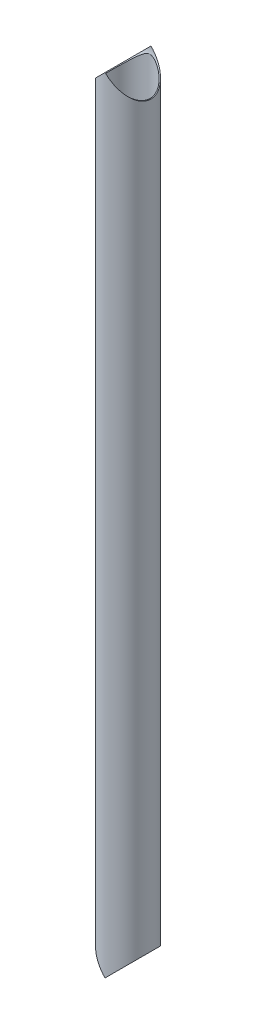
ISO-10303-21;
HEADER;
FILE_DESCRIPTION(('STEP AP214'),'2;1');
FILE_NAME('part.step','',(''),(''),'','','');
FILE_SCHEMA(('AUTOMOTIVE_DESIGN { 1 0 10303 214 1 1 1 1 }'));
ENDSEC;
DATA;
#1=APPLICATION_CONTEXT('core data for automotive mechanical design processes');
#2=APPLICATION_PROTOCOL_DEFINITION('international standard','automotive_design',2000,#1);
#3=PRODUCT_CONTEXT('',#1,'mechanical');
#4=PRODUCT('Part','Part','',(#3));
#5=PRODUCT_RELATED_PRODUCT_CATEGORY('part','',(#4));
#6=PRODUCT_DEFINITION_FORMATION('','',#4);
#7=PRODUCT_DEFINITION_CONTEXT('part definition',#1,'design');
#8=PRODUCT_DEFINITION('design','',#6,#7);
#9=PRODUCT_DEFINITION_SHAPE('','',#8);
#10=(LENGTH_UNIT() NAMED_UNIT(*) SI_UNIT(.MILLI.,.METRE.));
#11=(NAMED_UNIT(*) PLANE_ANGLE_UNIT() SI_UNIT($,.RADIAN.));
#12=(NAMED_UNIT(*) SI_UNIT($,.STERADIAN.) SOLID_ANGLE_UNIT());
#13=UNCERTAINTY_MEASURE_WITH_UNIT(LENGTH_MEASURE(1.E-05),#10,'distance_accuracy_value','');
#14=(GEOMETRIC_REPRESENTATION_CONTEXT(3) GLOBAL_UNCERTAINTY_ASSIGNED_CONTEXT((#13)) GLOBAL_UNIT_ASSIGNED_CONTEXT((#10,
#11,#12)) REPRESENTATION_CONTEXT('',''));
#15=CARTESIAN_POINT('',(0.,0.,0.));
#16=DIRECTION('',(0.,0.,1.));
#17=DIRECTION('',(1.,0.,0.));
#18=AXIS2_PLACEMENT_3D('',#15,#16,#17);
#19=CARTESIAN_POINT('',(476.510652388512,439.748427831157,242.672));
#20=DIRECTION('',(0.,1.,0.));
#21=DIRECTION('',(0.,0.,1.));
#22=AXIS2_PLACEMENT_3D('',#19,#20,#21);
#23=CYLINDRICAL_SURFACE('',#22,36.449);
#24=CARTESIAN_POINT('',(476.510652388512,-744.394911587708,206.223));
#25=CARTESIAN_POINT('',(476.866214470513,-744.39494214941,206.222994341681));
#26=CARTESIAN_POINT('',(477.22169744149,-744.377731995319,206.228216789073));
#27=CARTESIAN_POINT('',(477.929288915522,-744.310119843228,206.248898686295));
#28=CARTESIAN_POINT('',(478.281396235833,-744.259706614009,206.264361600058));
#29=CARTESIAN_POINT('',(478.98026219395,-744.128568465547,206.305069995408));
#30=CARTESIAN_POINT('',(479.327003101667,-744.047759096471,206.330342738024));
#31=CARTESIAN_POINT('',(480.012599362523,-743.860004194211,206.38998675138));
#32=CARTESIAN_POINT('',(480.351450551549,-743.753045187291,206.424362713364));
#33=CARTESIAN_POINT('',(481.228907293262,-743.444000358809,206.525541561417));
#34=CARTESIAN_POINT('',(481.760454369489,-743.224162276086,206.599204699403));
#35=CARTESIAN_POINT('',(482.801588995718,-742.743779294375,206.766119585938));
#36=CARTESIAN_POINT('',(483.311156804661,-742.483198734746,206.859388519708));
#37=CARTESIAN_POINT('',(484.312763012002,-741.932604577901,207.0641519399));
#38=CARTESIAN_POINT('',(484.804726788288,-741.642482062202,207.175714869938));
#39=CARTESIAN_POINT('',(485.771820306411,-741.042409921515,207.415674780719));
#40=CARTESIAN_POINT('',(486.246954704936,-740.732465848808,207.544067057825));
#41=CARTESIAN_POINT('',(487.266603779474,-740.042198013802,207.841420001988));
#42=CARTESIAN_POINT('',(487.80836925102,-739.659184876873,208.013531536308));
#43=CARTESIAN_POINT('',(488.87543085832,-738.880783163589,208.379727216007));
#44=CARTESIAN_POINT('',(489.400723310257,-738.485391858089,208.573816232035));
#45=CARTESIAN_POINT('',(490.437331743452,-737.68672295155,208.983899692639));
#46=CARTESIAN_POINT('',(490.948635050469,-737.283438732129,209.19991321761));
#47=CARTESIAN_POINT('',(491.958171546318,-736.472873100907,209.653672548512));
#48=CARTESIAN_POINT('',(492.456405767359,-736.065592008296,209.891416631452));
#49=CARTESIAN_POINT('',(493.440619034516,-735.249791922159,210.388726759251));
#50=CARTESIAN_POINT('',(493.926600620858,-734.841273205221,210.648288231739));
#51=CARTESIAN_POINT('',(494.886870092055,-734.02510628716,211.189497413899));
#52=CARTESIAN_POINT('',(495.361157778266,-733.617458100932,211.47114549842));
#53=CARTESIAN_POINT('',(496.297926045137,-732.805107847448,212.056671875453));
#54=CARTESIAN_POINT('',(496.76041234121,-732.400404424638,212.360539120597));
#55=CARTESIAN_POINT('',(497.673612858566,-731.595455924155,212.990919749797));
#56=CARTESIAN_POINT('',(498.124327139144,-731.195210824031,213.317433019758));
#57=CARTESIAN_POINT('',(499.361010825508,-730.09040858349,214.257556049199));
#58=CARTESIAN_POINT('',(500.133963413513,-729.392259287886,214.89626834423));
#59=CARTESIAN_POINT('',(501.261536898625,-728.365968421374,215.910483676035));
#60=CARTESIAN_POINT('',(501.632116693218,-728.027331442462,216.257946305791));
#61=CARTESIAN_POINT('',(502.362142888818,-727.357974170071,216.971983785208));
#62=CARTESIAN_POINT('',(502.721586086722,-727.027256160343,217.338564053603));
#63=CARTESIAN_POINT('',(503.780468870795,-726.050165598925,218.465632790855));
#64=CARTESIAN_POINT('',(504.462136991515,-725.417327620266,219.254948387263));
#65=CARTESIAN_POINT('',(505.770295445402,-724.197678563114,220.911565230277));
#66=CARTESIAN_POINT('',(506.396781671707,-723.610870910741,221.778872271634));
#67=CARTESIAN_POINT('',(507.431487216752,-722.638565247095,223.35679609504));
#68=CARTESIAN_POINT('',(507.8542735571,-722.24023253352,224.049984677227));
#69=CARTESIAN_POINT('',(508.659722856575,-721.479875204254,225.477866546872));
#70=CARTESIAN_POINT('',(509.042408888654,-721.117829714861,226.212535588599));
#71=CARTESIAN_POINT('',(509.763115456915,-720.434922004253,227.721993550622));
#72=CARTESIAN_POINT('',(510.101135106722,-720.114060600314,228.496783266662));
#73=CARTESIAN_POINT('',(510.727447244554,-719.518807173107,230.083593810325));
#74=CARTESIAN_POINT('',(511.01573889482,-719.244415932718,230.895615264895));
#75=CARTESIAN_POINT('',(511.540119330834,-718.744854467708,232.560845994832));
#76=CARTESIAN_POINT('',(511.775658917312,-718.520202327098,233.414385231727));
#77=CARTESIAN_POINT('',(512.185970146604,-718.128599177966,235.149007089444));
#78=CARTESIAN_POINT('',(512.360741428082,-717.961648512544,236.030089874011));
#79=CARTESIAN_POINT('',(512.64534167251,-717.689675194672,237.811297616409));
#80=CARTESIAN_POINT('',(512.755231478546,-717.584594523434,238.711403911534));
#81=CARTESIAN_POINT('',(512.907551461152,-717.43891897675,240.522436149383));
#82=CARTESIAN_POINT('',(512.949993046362,-717.398313195597,241.433360236047));
#83=CARTESIAN_POINT('',(512.96514823909,-717.383814249575,243.119793163351));
#84=CARTESIAN_POINT('',(512.947345982775,-717.400847076913,243.895167050997));
#85=CARTESIAN_POINT('',(512.862581349637,-717.481928351017,245.440678453986));
#86=CARTESIAN_POINT('',(512.795624878822,-717.545971149412,246.210816587199));
#87=CARTESIAN_POINT('',(512.613789731592,-717.719822536052,247.740154940216));
#88=CARTESIAN_POINT('',(512.498910096987,-717.829632039371,248.499354941006));
#89=CARTESIAN_POINT('',(512.223243904488,-718.09297702271,250.001644127843));
#90=CARTESIAN_POINT('',(512.062455617583,-718.246514149597,250.744732705969));
#91=CARTESIAN_POINT('',(511.701861985554,-718.590579089877,252.193153917395));
#92=CARTESIAN_POINT('',(511.503057004658,-718.780157892214,252.898963110777));
#93=CARTESIAN_POINT('',(511.066964962222,-719.195618958146,254.287526244673));
#94=CARTESIAN_POINT('',(510.829679872922,-719.42149936115,254.970281364623));
#95=CARTESIAN_POINT('',(510.319568215591,-719.906535028414,256.310213087119));
#96=CARTESIAN_POINT('',(510.046738229427,-720.165693492785,256.967387221795));
#97=CARTESIAN_POINT('',(509.468471050447,-720.714227386438,258.254348100605));
#98=CARTESIAN_POINT('',(509.163027011418,-721.003609159798,258.88412905527));
#99=CARTESIAN_POINT('',(508.608659120239,-721.527966985482,259.949291297323));
#100=CARTESIAN_POINT('',(508.366625955861,-721.756645379099,260.391404719744));
#101=CARTESIAN_POINT('',(507.867842330127,-722.227278037621,261.259817195315));
#102=CARTESIAN_POINT('',(507.611094558151,-722.469229876203,261.686119115013));
#103=CARTESIAN_POINT('',(506.82002390388,-723.213595007675,262.941437286861));
#104=CARTESIAN_POINT('',(506.264969333909,-723.734427324938,263.746683560699));
#105=CARTESIAN_POINT('',(505.105886481022,-724.817827335624,265.294550970115));
#106=CARTESIAN_POINT('',(504.501743544192,-725.380492460086,266.037016716067));
#107=CARTESIAN_POINT('',(503.251643952636,-726.539015973301,267.457970035601));
#108=CARTESIAN_POINT('',(502.60568849643,-727.134873410556,268.136459441644));
#109=CARTESIAN_POINT('',(501.492814994195,-728.154903392491,269.220317238375));
#110=CARTESIAN_POINT('',(501.035898517613,-728.571972181724,269.642812616338));
#111=CARTESIAN_POINT('',(500.10638496387,-729.416076973201,270.45965533636));
#112=CARTESIAN_POINT('',(499.633788276544,-729.84311272757,270.854003377444));
#113=CARTESIAN_POINT('',(498.673581379377,-730.705384892667,271.615216377981));
#114=CARTESIAN_POINT('',(498.185963162426,-731.140625627298,271.982066309183));
#115=CARTESIAN_POINT('',(497.196587700303,-732.017054827887,272.688514867113));
#116=CARTESIAN_POINT('',(496.694830874212,-732.458243117351,273.028114300425));
#117=CARTESIAN_POINT('',(495.677966334072,-733.344005516987,273.680194933274));
#118=CARTESIAN_POINT('',(495.162872085164,-733.788575915159,273.99270219679));
#119=CARTESIAN_POINT('',(494.118769551406,-734.679174103479,274.591367180444));
#120=CARTESIAN_POINT('',(493.58976058219,-735.125201964362,274.877523601444));
#121=CARTESIAN_POINT('',(492.51766860484,-736.01560781731,275.423591294656));
#122=CARTESIAN_POINT('',(491.974594759868,-736.459986678135,275.683519139683));
#123=CARTESIAN_POINT('',(490.873005380616,-737.34384540984,276.17747499688));
#124=CARTESIAN_POINT('',(490.314492050232,-737.783325967485,276.411506681958));
#125=CARTESIAN_POINT('',(489.286667000424,-738.571047755042,276.81211379431));
#126=CARTESIAN_POINT('',(488.820318336025,-738.920913349901,276.983100595245));
#127=CARTESIAN_POINT('',(487.87457696487,-739.610960256955,277.307832010658));
#128=CARTESIAN_POINT('',(487.395184276413,-739.951141582734,277.461576649326));
#129=CARTESIAN_POINT('',(486.42133936682,-740.617091151689,277.751424175755));
#130=CARTESIAN_POINT('',(485.926889372417,-740.942861508706,277.887529656569));
#131=CARTESIAN_POINT('',(484.920176053243,-741.573390079684,278.141409766625));
#132=CARTESIAN_POINT('',(484.407917446481,-741.878153796039,278.259189206358));
#133=CARTESIAN_POINT('',(483.528797639687,-742.364779586244,278.440805594312));
#134=CARTESIAN_POINT('',(483.167588150206,-742.554871444225,278.509875866972));
#135=CARTESIAN_POINT('',(482.434208972682,-742.916599577116,278.638369246777));
#136=CARTESIAN_POINT('',(482.062037781871,-743.088233306408,278.697791023842));
#137=CARTESIAN_POINT('',(481.307014479821,-743.407315730861,278.806049104647));
#138=CARTESIAN_POINT('',(480.924193199586,-743.55482715098,278.854912971963));
#139=CARTESIAN_POINT('',(480.14717040079,-743.819820773527,278.941243359243));
#140=CARTESIAN_POINT('',(479.75297612085,-743.937321627284,278.978716960931));
#141=CARTESIAN_POINT('',(478.88965933871,-744.151585357063,279.046251308342));
#142=CARTESIAN_POINT('',(478.418718898684,-744.241932687243,279.074136924716));
#143=CARTESIAN_POINT('',(477.468683171403,-744.363547348822,279.111498775102));
#144=CARTESIAN_POINT('',(476.989596009632,-744.394870420968,279.120992378221));
#145=CARTESIAN_POINT('',(476.155090306511,-744.39494214941,279.121005658319));
#146=CARTESIAN_POINT('',(475.799607335534,-744.377731995319,279.115783210927));
#147=CARTESIAN_POINT('',(475.092015861502,-744.310119843228,279.095101313705));
#148=CARTESIAN_POINT('',(474.739908541191,-744.259706614009,279.079638399942));
#149=CARTESIAN_POINT('',(474.041042583074,-744.128568465547,279.038930004592));
#150=CARTESIAN_POINT('',(473.694301675357,-744.047759096471,279.013657261976));
#151=CARTESIAN_POINT('',(473.008705414501,-743.860004194211,278.95401324862));
#152=CARTESIAN_POINT('',(472.669854225475,-743.753045187291,278.919637286637));
#153=CARTESIAN_POINT('',(471.792397483762,-743.444000358809,278.818458438583));
#154=CARTESIAN_POINT('',(471.260850407535,-743.224162276086,278.744795300597));
#155=CARTESIAN_POINT('',(470.219715781306,-742.743779294375,278.577880414062));
#156=CARTESIAN_POINT('',(469.710147972363,-742.483198734746,278.484611480292));
#157=CARTESIAN_POINT('',(468.708541765022,-741.932604577901,278.2798480601));
#158=CARTESIAN_POINT('',(468.216577988736,-741.642482062202,278.168285130062));
#159=CARTESIAN_POINT('',(467.249484470613,-741.042409921515,277.928325219281));
#160=CARTESIAN_POINT('',(466.774350072088,-740.732465848808,277.799932942175));
#161=CARTESIAN_POINT('',(465.75470099755,-740.042198013802,277.502579998012));
#162=CARTESIAN_POINT('',(465.212935526004,-739.659184876873,277.330468463692));
#163=CARTESIAN_POINT('',(464.145873918704,-738.880783163589,276.964272783993));
#164=CARTESIAN_POINT('',(463.620581466767,-738.485391858089,276.770183767965));
#165=CARTESIAN_POINT('',(462.583973033572,-737.68672295155,276.360100307361));
#166=CARTESIAN_POINT('',(462.072669726555,-737.283438732129,276.14408678239));
#167=CARTESIAN_POINT('',(461.063133230706,-736.472873100907,275.690327451488));
#168=CARTESIAN_POINT('',(460.564899009665,-736.065592008296,275.452583368548));
#169=CARTESIAN_POINT('',(459.580685742508,-735.249791922158,274.955273240749));
#170=CARTESIAN_POINT('',(459.094704156166,-734.841273205221,274.695711768261));
#171=CARTESIAN_POINT('',(458.134434684969,-734.02510628716,274.154502586101));
#172=CARTESIAN_POINT('',(457.660146998758,-733.617458100932,273.87285450158));
#173=CARTESIAN_POINT('',(456.723378731887,-732.805107847448,273.287328124547));
#174=CARTESIAN_POINT('',(456.260892435814,-732.400404424638,272.983460879403));
#175=CARTESIAN_POINT('',(455.347691918458,-731.595455924155,272.353080250203));
#176=CARTESIAN_POINT('',(454.89697763788,-731.195210824031,272.026566980242));
#177=CARTESIAN_POINT('',(453.660293951516,-730.09040858349,271.086443950801));
#178=CARTESIAN_POINT('',(452.887341363511,-729.392259287886,270.44773165577));
#179=CARTESIAN_POINT('',(451.759767878399,-728.365968421374,269.433516323965));
#180=CARTESIAN_POINT('',(451.389188083806,-728.027331442462,269.086053694209));
#181=CARTESIAN_POINT('',(450.659161888206,-727.357974170071,268.372016214792));
#182=CARTESIAN_POINT('',(450.299718690302,-727.027256160343,268.005435946397));
#183=CARTESIAN_POINT('',(449.240835906229,-726.050165598925,266.878367209145));
#184=CARTESIAN_POINT('',(448.55916778551,-725.417327620266,266.089051612737));
#185=CARTESIAN_POINT('',(447.251009331622,-724.197678563114,264.432434769723));
#186=CARTESIAN_POINT('',(446.624523105317,-723.610870910741,263.565127728366));
#187=CARTESIAN_POINT('',(445.589817560272,-722.638565247095,261.98720390496));
#188=CARTESIAN_POINT('',(445.167031219924,-722.24023253352,261.294015322773));
#189=CARTESIAN_POINT('',(444.361581920449,-721.479875204254,259.866133453128));
#190=CARTESIAN_POINT('',(443.97889588837,-721.117829714861,259.1314644114));
#191=CARTESIAN_POINT('',(443.258189320109,-720.434922004253,257.622006449378));
#192=CARTESIAN_POINT('',(442.920169670303,-720.114060600314,256.847216733338));
#193=CARTESIAN_POINT('',(442.29385753247,-719.518807173107,255.260406189675));
#194=CARTESIAN_POINT('',(442.005565882204,-719.244415932718,254.448384735105));
#195=CARTESIAN_POINT('',(441.48118544619,-718.744854467708,252.783154005168));
#196=CARTESIAN_POINT('',(441.245645859712,-718.520202327098,251.929614768273));
#197=CARTESIAN_POINT('',(440.83533463042,-718.128599177966,250.194992910556));
#198=CARTESIAN_POINT('',(440.660563348942,-717.961648512544,249.313910125989));
#199=CARTESIAN_POINT('',(440.375963104514,-717.689675194672,247.532702383591));
#200=CARTESIAN_POINT('',(440.266073298478,-717.584594523434,246.632596088466));
#201=CARTESIAN_POINT('',(440.113753315872,-717.43891897675,244.821563850617));
#202=CARTESIAN_POINT('',(440.071311730662,-717.398313195597,243.910639763953));
#203=CARTESIAN_POINT('',(440.056156537934,-717.383814249575,242.224206836649));
#204=CARTESIAN_POINT('',(440.073958794249,-717.400847076913,241.448832949003));
#205=CARTESIAN_POINT('',(440.158723427387,-717.481928351017,239.903321546014));
#206=CARTESIAN_POINT('',(440.225679898202,-717.545971149412,239.133183412801));
#207=CARTESIAN_POINT('',(440.407515045432,-717.719822536052,237.603845059783));
#208=CARTESIAN_POINT('',(440.522394680037,-717.829632039371,236.844645058994));
#209=CARTESIAN_POINT('',(440.798060872536,-718.09297702271,235.342355872157));
#210=CARTESIAN_POINT('',(440.958849159441,-718.246514149597,234.59926729403));
#211=CARTESIAN_POINT('',(441.31944279147,-718.590579089877,233.150846082605));
#212=CARTESIAN_POINT('',(441.518247772366,-718.780157892214,232.445036889223));
#213=CARTESIAN_POINT('',(441.954339814802,-719.195618958146,231.056473755327));
#214=CARTESIAN_POINT('',(442.191624904102,-719.42149936115,230.373718635377));
#215=CARTESIAN_POINT('',(442.701736561433,-719.906535028414,229.033786912881));
#216=CARTESIAN_POINT('',(442.974566547597,-720.165693492785,228.376612778205));
#217=CARTESIAN_POINT('',(443.552833726577,-720.714227386438,227.089651899395));
#218=CARTESIAN_POINT('',(443.858277765606,-721.003609159798,226.45987094473));
#219=CARTESIAN_POINT('',(444.412645656785,-721.527966985483,225.394708702677));
#220=CARTESIAN_POINT('',(444.654678821163,-721.756645379099,224.952595280256));
#221=CARTESIAN_POINT('',(445.153462446897,-722.227278037621,224.084182804685));
#222=CARTESIAN_POINT('',(445.410210218873,-722.469229876203,223.657880884987));
#223=CARTESIAN_POINT('',(446.201280873144,-723.213595007675,222.402562713139));
#224=CARTESIAN_POINT('',(446.756335443115,-723.734427324938,221.597316439301));
#225=CARTESIAN_POINT('',(447.915418296002,-724.817827335624,220.049449029885));
#226=CARTESIAN_POINT('',(448.519561232832,-725.380492460086,219.306983283933));
#227=CARTESIAN_POINT('',(449.769660824388,-726.539015973301,217.886029964399));
#228=CARTESIAN_POINT('',(450.415616280594,-727.134873410556,217.207540558356));
#229=CARTESIAN_POINT('',(451.528489782829,-728.154903392491,216.123682761625));
#230=CARTESIAN_POINT('',(451.985406259411,-728.571972181724,215.701187383662));
#231=CARTESIAN_POINT('',(452.914919813155,-729.416076973201,214.88434466364));
#232=CARTESIAN_POINT('',(453.38751650048,-729.84311272757,214.489996622556));
#233=CARTESIAN_POINT('',(454.347723397647,-730.705384892667,213.728783622019));
#234=CARTESIAN_POINT('',(454.835341614599,-731.140625627299,213.361933690817));
#235=CARTESIAN_POINT('',(455.824717076722,-732.017054827887,212.655485132887));
#236=CARTESIAN_POINT('',(456.326473902812,-732.458243117351,212.315885699575));
#237=CARTESIAN_POINT('',(457.343338442953,-733.344005516987,211.663805066726));
#238=CARTESIAN_POINT('',(457.858432691861,-733.788575915159,211.35129780321));
#239=CARTESIAN_POINT('',(458.902535225618,-734.679174103479,210.752632819556));
#240=CARTESIAN_POINT('',(459.431544194834,-735.125201964362,210.466476398556));
#241=CARTESIAN_POINT('',(460.503636172184,-736.01560781731,209.920408705344));
#242=CARTESIAN_POINT('',(461.046710017157,-736.459986678135,209.660480860317));
#243=CARTESIAN_POINT('',(462.148299396409,-737.34384540984,209.16652500312));
#244=CARTESIAN_POINT('',(462.706812726792,-737.783325967485,208.932493318042));
#245=CARTESIAN_POINT('',(463.734637776601,-738.571047755042,208.53188620569));
#246=CARTESIAN_POINT('',(464.200986440999,-738.920913349901,208.360899404755));
#247=CARTESIAN_POINT('',(465.146727812155,-739.610960256955,208.036167989342));
#248=CARTESIAN_POINT('',(465.626120500611,-739.951141582734,207.882423350674));
#249=CARTESIAN_POINT('',(466.599965410204,-740.617091151689,207.592575824245));
#250=CARTESIAN_POINT('',(467.094415404607,-740.942861508706,207.456470343431));
#251=CARTESIAN_POINT('',(468.101128723781,-741.573390079684,207.202590233375));
#252=CARTESIAN_POINT('',(468.613387330543,-741.878153796039,207.084810793642));
#253=CARTESIAN_POINT('',(469.492507137337,-742.364779586244,206.903194405688));
#254=CARTESIAN_POINT('',(469.853716626818,-742.554871444225,206.834124133028));
#255=CARTESIAN_POINT('',(470.587095804342,-742.916599577116,206.705630753223));
#256=CARTESIAN_POINT('',(470.959266995153,-743.088233306408,206.646208976158));
#257=CARTESIAN_POINT('',(471.714290297204,-743.407315730861,206.537950895353));
#258=CARTESIAN_POINT('',(472.097111577438,-743.55482715098,206.489087028037));
#259=CARTESIAN_POINT('',(472.874134376234,-743.819820773527,206.402756640757));
#260=CARTESIAN_POINT('',(473.268328656174,-743.937321627284,206.365283039069));
#261=CARTESIAN_POINT('',(474.131645438314,-744.151585357063,206.297748691658));
#262=CARTESIAN_POINT('',(474.60258587834,-744.241932687243,206.269863075285));
#263=CARTESIAN_POINT('',(475.552621605621,-744.363547348822,206.232501224898));
#264=CARTESIAN_POINT('',(476.031708767392,-744.394870420968,206.223007621779));
#265=CARTESIAN_POINT('',(476.510652388512,-744.394911587708,206.223));
#266=B_SPLINE_CURVE_WITH_KNOTS('',3,(#24,#25,#26,#27,#28,#29,#30,#31,#32,#33,#34,#35,#36,#37,
#38,#39,#40,#41,#42,#43,#44,#45,#46,#47,#48,#49,#50,#51,#52,#53,#54,#55,#56,#57,#58,#59,#60,#61,
#62,#63,#64,#65,#66,#67,#68,#69,#70,#71,#72,#73,#74,#75,#76,#77,#78,#79,#80,#81,#82,#83,#84,#85,
#86,#87,#88,#89,#90,#91,#92,#93,#94,#95,#96,#97,#98,#99,#100,#101,#102,#103,#104,#105,#106,#107,
#108,#109,#110,#111,#112,#113,#114,#115,#116,#117,#118,#119,#120,#121,#122,#123,#124,#125,#126,
#127,#128,#129,#130,#131,#132,#133,#134,#135,#136,#137,#138,#139,#140,#141,#142,#143,#144,#145,
#146,#147,#148,#149,#150,#151,#152,#153,#154,#155,#156,#157,#158,#159,#160,#161,#162,#163,#164,
#165,#166,#167,#168,#169,#170,#171,#172,#173,#174,#175,#176,#177,#178,#179,#180,#181,#182,#183,
#184,#185,#186,#187,#188,#189,#190,#191,#192,#193,#194,#195,#196,#197,#198,#199,#200,#201,#202,
#203,#204,#205,#206,#207,#208,#209,#210,#211,#212,#213,#214,#215,#216,#217,#218,#219,#220,#221,
#222,#223,#224,#225,#226,#227,#228,#229,#230,#231,#232,#233,#234,#235,#236,#237,#238,#239,#240,
#241,#242,#243,#244,#245,#246,#247,#248,#249,#250,#251,#252,#253,#254,#255,#256,#257,#258,#259,
#260,#261,#262,#263,#264,#265),.UNSPECIFIED.,.T.,.F.,(4,2,2,2,2,2,2,2,2,2,2,2,2,2,2,2,2,2,2,2,2,
2,2,2,2,2,2,2,2,2,2,2,2,2,2,2,2,2,2,2,2,2,2,2,2,2,2,2,2,2,2,2,2,2,2,2,2,2,2,2,2,2,2,2,2,2,2,2,2,
2,2,2,2,2,2,2,2,2,2,2,2,2,2,2,2,2,2,2,2,2,2,2,2,2,2,2,2,2,2,2,2,2,2,2,2,2,2,2,2,2,2,2,2,2,2,2,2,
2,2,2,4),(0.,1.06611414843416,2.13258910425996,3.20204920766219,4.27206152160816,
6.00863124127422,7.74672952495685,9.4914855092719,11.2357548870451,13.2912846778382,
15.3472709100309,17.4050620168485,19.4626901051605,21.5198880369984,23.5771208905832,
25.633337753172,27.6895442568481,31.3512740154256,33.1824611102563,35.0141700909461,
38.6694544918159,42.3250107044665,45.0358911223804,47.745203086163,50.4545688064838,
53.1639801666921,55.9004081106272,58.636852325462,61.3707263268616,64.1041378534623,
66.428502550992,68.7525880157006,71.0767199511114,73.4009394294494,75.6708059402843,
77.9405561492151,80.2105247872817,82.4809708684053,84.1408274219292,85.8003815658468,
89.1201624002975,92.4479332286087,95.7756087113101,98.0223469896221,100.269029451901,
102.516930950406,104.764765889109,107.010413731493,109.256172228638,111.500502714162,
113.74451447239,115.566784640591,117.389052252358,119.211051676383,121.032572025353,
122.273977222302,123.515553406376,124.753847952514,125.991371025463,127.428789407635,
128.864849653164,129.930963801598,130.997438757424,132.066898860826,133.136911174772,
134.873480894438,136.61157917812,138.356335162435,140.100604540209,142.156134331002,
144.212120563194,146.269911670012,148.327539758324,150.384737690162,152.441970543747,
154.498187406336,156.554393910012,160.216123668589,162.04731076342,163.87901974411,
167.534304144979,171.18986035763,173.900740775544,176.610052739327,179.319418459647,
182.028829819856,184.765257763791,187.501701978626,190.235575980025,192.968987506626,
195.293352204156,197.617437668864,199.941569604275,202.265789082613,204.535655593448,
206.805405802379,209.075374440445,211.345820521569,213.005677075093,214.665231219011,
217.985012053461,221.312782881773,224.640458364474,226.887196642786,229.133879105065,
231.38178060357,233.629615542273,235.875263384657,238.121021881802,240.365352367326,
242.609364125554,244.431634293755,246.253901905522,248.075901329547,249.897421678517,
251.138826875466,252.380403059539,253.618697605678,254.856220678626,256.293639060799,
257.729699306327),.UNSPECIFIED.);
#267=CARTESIAN_POINT('',(476.510652388512,-744.394911587708,206.223));
#268=VERTEX_POINT('',#267);
#269=EDGE_CURVE('E20',#268,#268,#266,.T.);
#270=ORIENTED_EDGE('',*,*,#269,.T.);
#271=EDGE_LOOP('',(#270));
#272=FACE_BOUND('',#271,.T.);
#273=CARTESIAN_POINT('',(476.510652388512,533.416767250023,206.223));
#274=CARTESIAN_POINT('',(476.155090306511,533.416797811724,206.222994341681));
#275=CARTESIAN_POINT('',(475.799607335534,533.399587657633,206.228216789073));
#276=CARTESIAN_POINT('',(475.092015861502,533.331975505543,206.248898686295));
#277=CARTESIAN_POINT('',(474.739908541191,533.281562276323,206.264361600058));
#278=CARTESIAN_POINT('',(474.041042583074,533.150424127861,206.305069995408));
#279=CARTESIAN_POINT('',(473.694301675357,533.069614758785,206.330342738024));
#280=CARTESIAN_POINT('',(473.008705414501,532.881859856525,206.38998675138));
#281=CARTESIAN_POINT('',(472.669854225475,532.774900849605,206.424362713363));
#282=CARTESIAN_POINT('',(471.792397483762,532.465856021123,206.525541561417));
#283=CARTESIAN_POINT('',(471.260850407535,532.2460179384,206.599204699403));
#284=CARTESIAN_POINT('',(470.219715781306,531.765634956689,206.766119585938));
#285=CARTESIAN_POINT('',(469.710147972363,531.50505439706,206.859388519708));
#286=CARTESIAN_POINT('',(468.708541765022,530.954460240215,207.0641519399));
#287=CARTESIAN_POINT('',(468.216577988736,530.664337724516,207.175714869938));
#288=CARTESIAN_POINT('',(467.249484470613,530.064265583829,207.415674780719));
#289=CARTESIAN_POINT('',(466.774350072088,529.754321511122,207.544067057825));
#290=CARTESIAN_POINT('',(465.75470099755,529.064053676116,207.841420001988));
#291=CARTESIAN_POINT('',(465.212935526004,528.681040539187,208.013531536308));
#292=CARTESIAN_POINT('',(464.145873918704,527.902638825903,208.379727216007));
#293=CARTESIAN_POINT('',(463.620581466767,527.507247520403,208.573816232035));
#294=CARTESIAN_POINT('',(462.583973033572,526.708578613864,208.983899692638));
#295=CARTESIAN_POINT('',(462.072669726555,526.305294394443,209.19991321761));
#296=CARTESIAN_POINT('',(461.063133230706,525.494728763221,209.653672548512));
#297=CARTESIAN_POINT('',(460.564899009665,525.08744767061,209.891416631452));
#298=CARTESIAN_POINT('',(459.580685742508,524.271647584473,210.388726759251));
#299=CARTESIAN_POINT('',(459.094704156167,523.863128867535,210.648288231739));
#300=CARTESIAN_POINT('',(458.134434684969,523.046961949474,211.189497413899));
#301=CARTESIAN_POINT('',(457.660146998758,522.639313763246,211.47114549842));
#302=CARTESIAN_POINT('',(456.723378731887,521.826963509762,212.056671875453));
#303=CARTESIAN_POINT('',(456.260892435814,521.422260086952,212.360539120597));
#304=CARTESIAN_POINT('',(455.347691918458,520.617311586469,212.990919749797));
#305=CARTESIAN_POINT('',(454.89697763788,520.217066486345,213.317433019758));
#306=CARTESIAN_POINT('',(453.660293951516,519.112264245804,214.257556049199));
#307=CARTESIAN_POINT('',(452.887341363511,518.4141149502,214.89626834423));
#308=CARTESIAN_POINT('',(451.759767878399,517.387824083688,215.910483676035));
#309=CARTESIAN_POINT('',(451.389188083806,517.049187104776,216.257946305791));
#310=CARTESIAN_POINT('',(450.659161888206,516.379829832385,216.971983785208));
#311=CARTESIAN_POINT('',(450.299718690302,516.049111822657,217.338564053603));
#312=CARTESIAN_POINT('',(449.240835906229,515.072021261239,218.465632790855));
#313=CARTESIAN_POINT('',(448.559167785509,514.43918328258,219.254948387264));
#314=CARTESIAN_POINT('',(447.251009331622,513.219534225428,220.911565230277));
#315=CARTESIAN_POINT('',(446.624523105317,512.632726573056,221.778872271634));
#316=CARTESIAN_POINT('',(445.589817560272,511.660420909409,223.35679609504));
#317=CARTESIAN_POINT('',(445.167031219924,511.262088195834,224.049984677227));
#318=CARTESIAN_POINT('',(444.361581920449,510.501730866568,225.477866546872));
#319=CARTESIAN_POINT('',(443.97889588837,510.139685377175,226.2125355886));
#320=CARTESIAN_POINT('',(443.258189320109,509.456777666567,227.721993550622));
#321=CARTESIAN_POINT('',(442.920169670303,509.135916262628,228.496783266662));
#322=CARTESIAN_POINT('',(442.29385753247,508.540662835421,230.083593810325));
#323=CARTESIAN_POINT('',(442.005565882204,508.266271595032,230.895615264895));
#324=CARTESIAN_POINT('',(441.48118544619,507.766710130022,232.560845994832));
#325=CARTESIAN_POINT('',(441.245645859712,507.542057989412,233.414385231727));
#326=CARTESIAN_POINT('',(440.83533463042,507.15045484028,235.149007089444));
#327=CARTESIAN_POINT('',(440.660563348942,506.983504174858,236.030089874011));
#328=CARTESIAN_POINT('',(440.375963104514,506.711530856986,237.811297616409));
#329=CARTESIAN_POINT('',(440.266073298478,506.606450185748,238.711403911534));
#330=CARTESIAN_POINT('',(440.113753315872,506.460774639064,240.522436149383));
#331=CARTESIAN_POINT('',(440.071311730662,506.420168857911,241.433360236047));
#332=CARTESIAN_POINT('',(440.056156537934,506.405669911889,243.119793163351));
#333=CARTESIAN_POINT('',(440.073958794249,506.422702739227,243.895167050997));
#334=CARTESIAN_POINT('',(440.158723427387,506.503784013331,245.440678453986));
#335=CARTESIAN_POINT('',(440.225679898202,506.567826811726,246.210816587199));
#336=CARTESIAN_POINT('',(440.407515045432,506.741678198366,247.740154940217));
#337=CARTESIAN_POINT('',(440.522394680037,506.851487701685,248.499354941006));
#338=CARTESIAN_POINT('',(440.798060872536,507.114832685024,250.001644127843));
#339=CARTESIAN_POINT('',(440.958849159441,507.268369811911,250.744732705969));
#340=CARTESIAN_POINT('',(441.31944279147,507.612434752191,252.193153917395));
#341=CARTESIAN_POINT('',(441.518247772366,507.802013554528,252.898963110777));
#342=CARTESIAN_POINT('',(441.954339814802,508.21747462046,254.287526244673));
#343=CARTESIAN_POINT('',(442.191624904102,508.443355023465,254.970281364623));
#344=CARTESIAN_POINT('',(442.701736561433,508.928390690728,256.310213087119));
#345=CARTESIAN_POINT('',(442.974566547597,509.187549155099,256.967387221795));
#346=CARTESIAN_POINT('',(443.552833726577,509.736083048752,258.254348100605));
#347=CARTESIAN_POINT('',(443.858277765606,510.025464822112,258.88412905527));
#348=CARTESIAN_POINT('',(444.412645656785,510.549822647797,259.949291297323));
#349=CARTESIAN_POINT('',(444.654678821163,510.778501041413,260.391404719744));
#350=CARTESIAN_POINT('',(445.153462446897,511.249133699935,261.259817195315));
#351=CARTESIAN_POINT('',(445.410210218873,511.491085538517,261.686119115013));
#352=CARTESIAN_POINT('',(446.201280873144,512.235450669989,262.941437286861));
#353=CARTESIAN_POINT('',(446.756335443115,512.756282987252,263.746683560699));
#354=CARTESIAN_POINT('',(447.915418296002,513.839682997938,265.294550970115));
#355=CARTESIAN_POINT('',(448.519561232832,514.4023481224,266.037016716067));
#356=CARTESIAN_POINT('',(449.769660824388,515.560871635615,267.457970035601));
#357=CARTESIAN_POINT('',(450.415616280594,516.15672907287,268.136459441644));
#358=CARTESIAN_POINT('',(451.528489782829,517.176759054805,269.220317238375));
#359=CARTESIAN_POINT('',(451.985406259411,517.593827844038,269.642812616338));
#360=CARTESIAN_POINT('',(452.914919813155,518.437932635515,270.45965533636));
#361=CARTESIAN_POINT('',(453.38751650048,518.864968389884,270.854003377444));
#362=CARTESIAN_POINT('',(454.347723397647,519.727240554981,271.615216377981));
#363=CARTESIAN_POINT('',(454.835341614599,520.162481289613,271.982066309183));
#364=CARTESIAN_POINT('',(455.824717076722,521.038910490201,272.688514867113));
#365=CARTESIAN_POINT('',(456.326473902812,521.480098779665,273.028114300425));
#366=CARTESIAN_POINT('',(457.343338442953,522.365861179301,273.680194933274));
#367=CARTESIAN_POINT('',(457.858432691861,522.810431577473,273.99270219679));
#368=CARTESIAN_POINT('',(458.902535225618,523.701029765793,274.591367180444));
#369=CARTESIAN_POINT('',(459.431544194834,524.147057626676,274.877523601444));
#370=CARTESIAN_POINT('',(460.503636172184,525.037463479624,275.423591294656));
#371=CARTESIAN_POINT('',(461.046710017157,525.481842340449,275.683519139683));
#372=CARTESIAN_POINT('',(462.148299396409,526.365701072154,276.17747499688));
#373=CARTESIAN_POINT('',(462.706812726792,526.805181629799,276.411506681958));
#374=CARTESIAN_POINT('',(463.734637776601,527.592903417356,276.81211379431));
#375=CARTESIAN_POINT('',(464.200986440999,527.942769012215,276.983100595245));
#376=CARTESIAN_POINT('',(465.146727812155,528.632815919269,277.307832010658));
#377=CARTESIAN_POINT('',(465.626120500611,528.972997245048,277.461576649326));
#378=CARTESIAN_POINT('',(466.599965410204,529.638946814003,277.751424175755));
#379=CARTESIAN_POINT('',(467.094415404607,529.96471717102,277.887529656569));
#380=CARTESIAN_POINT('',(468.101128723781,530.595245741998,278.141409766625));
#381=CARTESIAN_POINT('',(468.613387330543,530.900009458353,278.259189206358));
#382=CARTESIAN_POINT('',(469.492507137337,531.386635248558,278.440805594312));
#383=CARTESIAN_POINT('',(469.853716626818,531.576727106539,278.509875866972));
#384=CARTESIAN_POINT('',(470.587095804342,531.93845523943,278.638369246777));
#385=CARTESIAN_POINT('',(470.959266995153,532.110088968722,278.697791023842));
#386=CARTESIAN_POINT('',(471.714290297204,532.429171393175,278.806049104647));
#387=CARTESIAN_POINT('',(472.097111577438,532.576682813294,278.854912971963));
#388=CARTESIAN_POINT('',(472.874134376234,532.841676435841,278.941243359243));
#389=CARTESIAN_POINT('',(473.268328656174,532.959177289598,278.978716960931));
#390=CARTESIAN_POINT('',(474.131645438314,533.173441019377,279.046251308342));
#391=CARTESIAN_POINT('',(474.60258587834,533.263788349557,279.074136924716));
#392=CARTESIAN_POINT('',(475.552621605621,533.385403011136,279.111498775102));
#393=CARTESIAN_POINT('',(476.031708767392,533.416726083282,279.120992378221));
#394=CARTESIAN_POINT('',(476.866214470513,533.416797811724,279.121005658319));
#395=CARTESIAN_POINT('',(477.22169744149,533.399587657633,279.115783210927));
#396=CARTESIAN_POINT('',(477.929288915522,533.331975505543,279.095101313705));
#397=CARTESIAN_POINT('',(478.281396235833,533.281562276323,279.079638399942));
#398=CARTESIAN_POINT('',(478.98026219395,533.150424127861,279.038930004592));
#399=CARTESIAN_POINT('',(479.327003101667,533.069614758785,279.013657261976));
#400=CARTESIAN_POINT('',(480.012599362523,532.881859856525,278.95401324862));
#401=CARTESIAN_POINT('',(480.351450551549,532.774900849605,278.919637286637));
#402=CARTESIAN_POINT('',(481.228907293262,532.465856021123,278.818458438583));
#403=CARTESIAN_POINT('',(481.760454369489,532.2460179384,278.744795300597));
#404=CARTESIAN_POINT('',(482.801588995718,531.765634956689,278.577880414062));
#405=CARTESIAN_POINT('',(483.311156804661,531.50505439706,278.484611480292));
#406=CARTESIAN_POINT('',(484.312763012002,530.954460240215,278.2798480601));
#407=CARTESIAN_POINT('',(484.804726788288,530.664337724516,278.168285130062));
#408=CARTESIAN_POINT('',(485.771820306411,530.064265583829,277.928325219281));
#409=CARTESIAN_POINT('',(486.246954704936,529.754321511122,277.799932942175));
#410=CARTESIAN_POINT('',(487.266603779474,529.064053676116,277.502579998012));
#411=CARTESIAN_POINT('',(487.80836925102,528.681040539187,277.330468463692));
#412=CARTESIAN_POINT('',(488.87543085832,527.902638825903,276.964272783993));
#413=CARTESIAN_POINT('',(489.400723310257,527.507247520403,276.770183767965));
#414=CARTESIAN_POINT('',(490.437331743452,526.708578613864,276.360100307361));
#415=CARTESIAN_POINT('',(490.948635050469,526.305294394443,276.14408678239));
#416=CARTESIAN_POINT('',(491.958171546318,525.494728763221,275.690327451488));
#417=CARTESIAN_POINT('',(492.456405767359,525.08744767061,275.452583368548));
#418=CARTESIAN_POINT('',(493.440619034516,524.271647584473,274.955273240749));
#419=CARTESIAN_POINT('',(493.926600620858,523.863128867535,274.695711768261));
#420=CARTESIAN_POINT('',(494.886870092055,523.046961949474,274.1545025861));
#421=CARTESIAN_POINT('',(495.361157778266,522.639313763246,273.87285450158));
#422=CARTESIAN_POINT('',(496.297926045137,521.826963509762,273.287328124547));
#423=CARTESIAN_POINT('',(496.76041234121,521.422260086952,272.983460879403));
#424=CARTESIAN_POINT('',(497.673612858566,520.617311586469,272.353080250203));
#425=CARTESIAN_POINT('',(498.124327139144,520.217066486345,272.026566980242));
#426=CARTESIAN_POINT('',(499.361010825508,519.112264245804,271.086443950801));
#427=CARTESIAN_POINT('',(500.133963413513,518.4141149502,270.44773165577));
#428=CARTESIAN_POINT('',(501.261536898625,517.387824083688,269.433516323965));
#429=CARTESIAN_POINT('',(501.632116693218,517.049187104776,269.086053694209));
#430=CARTESIAN_POINT('',(502.362142888818,516.379829832385,268.372016214792));
#431=CARTESIAN_POINT('',(502.721586086722,516.049111822657,268.005435946397));
#432=CARTESIAN_POINT('',(503.780468870795,515.072021261239,266.878367209145));
#433=CARTESIAN_POINT('',(504.462136991515,514.43918328258,266.089051612737));
#434=CARTESIAN_POINT('',(505.770295445402,513.219534225428,264.432434769723));
#435=CARTESIAN_POINT('',(506.396781671707,512.632726573056,263.565127728366));
#436=CARTESIAN_POINT('',(507.431487216752,511.660420909409,261.98720390496));
#437=CARTESIAN_POINT('',(507.8542735571,511.262088195834,261.294015322773));
#438=CARTESIAN_POINT('',(508.659722856575,510.501730866568,259.866133453128));
#439=CARTESIAN_POINT('',(509.042408888654,510.139685377175,259.1314644114));
#440=CARTESIAN_POINT('',(509.763115456915,509.456777666567,257.622006449378));
#441=CARTESIAN_POINT('',(510.101135106722,509.135916262628,256.847216733338));
#442=CARTESIAN_POINT('',(510.727447244554,508.540662835421,255.260406189675));
#443=CARTESIAN_POINT('',(511.01573889482,508.266271595032,254.448384735105));
#444=CARTESIAN_POINT('',(511.540119330834,507.766710130022,252.783154005168));
#445=CARTESIAN_POINT('',(511.775658917312,507.542057989412,251.929614768273));
#446=CARTESIAN_POINT('',(512.185970146604,507.15045484028,250.194992910556));
#447=CARTESIAN_POINT('',(512.360741428082,506.983504174858,249.313910125989));
#448=CARTESIAN_POINT('',(512.64534167251,506.711530856986,247.532702383591));
#449=CARTESIAN_POINT('',(512.755231478546,506.606450185748,246.632596088466));
#450=CARTESIAN_POINT('',(512.907551461152,506.460774639064,244.821563850617));
#451=CARTESIAN_POINT('',(512.949993046362,506.420168857911,243.910639763953));
#452=CARTESIAN_POINT('',(512.96514823909,506.405669911889,242.224206836649));
#453=CARTESIAN_POINT('',(512.947345982775,506.422702739227,241.448832949003));
#454=CARTESIAN_POINT('',(512.862581349637,506.503784013331,239.903321546014));
#455=CARTESIAN_POINT('',(512.795624878822,506.567826811726,239.133183412801));
#456=CARTESIAN_POINT('',(512.613789731592,506.741678198366,237.603845059783));
#457=CARTESIAN_POINT('',(512.498910096987,506.851487701685,236.844645058994));
#458=CARTESIAN_POINT('',(512.223243904488,507.114832685024,235.342355872157));
#459=CARTESIAN_POINT('',(512.062455617583,507.268369811911,234.59926729403));
#460=CARTESIAN_POINT('',(511.701861985554,507.612434752191,233.150846082605));
#461=CARTESIAN_POINT('',(511.503057004658,507.802013554528,232.445036889223));
#462=CARTESIAN_POINT('',(511.066964962222,508.21747462046,231.056473755327));
#463=CARTESIAN_POINT('',(510.829679872922,508.443355023465,230.373718635377));
#464=CARTESIAN_POINT('',(510.319568215591,508.928390690728,229.033786912881));
#465=CARTESIAN_POINT('',(510.046738229427,509.187549155099,228.376612778205));
#466=CARTESIAN_POINT('',(509.468471050447,509.736083048752,227.089651899395));
#467=CARTESIAN_POINT('',(509.163027011418,510.025464822112,226.45987094473));
#468=CARTESIAN_POINT('',(508.608659120239,510.549822647797,225.394708702677));
#469=CARTESIAN_POINT('',(508.366625955861,510.778501041413,224.952595280256));
#470=CARTESIAN_POINT('',(507.867842330127,511.249133699935,224.084182804685));
#471=CARTESIAN_POINT('',(507.611094558151,511.491085538517,223.657880884987));
#472=CARTESIAN_POINT('',(506.82002390388,512.235450669989,222.402562713139));
#473=CARTESIAN_POINT('',(506.264969333909,512.756282987252,221.597316439301));
#474=CARTESIAN_POINT('',(505.105886481022,513.839682997938,220.049449029885));
#475=CARTESIAN_POINT('',(504.501743544192,514.4023481224,219.306983283933));
#476=CARTESIAN_POINT('',(503.251643952636,515.560871635615,217.886029964399));
#477=CARTESIAN_POINT('',(502.60568849643,516.15672907287,217.207540558356));
#478=CARTESIAN_POINT('',(501.492814994195,517.176759054805,216.123682761625));
#479=CARTESIAN_POINT('',(501.035898517613,517.593827844038,215.701187383662));
#480=CARTESIAN_POINT('',(500.10638496387,518.437932635515,214.88434466364));
#481=CARTESIAN_POINT('',(499.633788276544,518.864968389884,214.489996622556));
#482=CARTESIAN_POINT('',(498.673581379377,519.727240554981,213.728783622019));
#483=CARTESIAN_POINT('',(498.185963162425,520.162481289613,213.361933690817));
#484=CARTESIAN_POINT('',(497.196587700302,521.038910490201,212.655485132887));
#485=CARTESIAN_POINT('',(496.694830874212,521.480098779665,212.315885699575));
#486=CARTESIAN_POINT('',(495.677966334071,522.365861179301,211.663805066726));
#487=CARTESIAN_POINT('',(495.162872085164,522.810431577473,211.35129780321));
#488=CARTESIAN_POINT('',(494.118769551406,523.701029765793,210.752632819556));
#489=CARTESIAN_POINT('',(493.58976058219,524.147057626676,210.466476398556));
#490=CARTESIAN_POINT('',(492.51766860484,525.037463479624,209.920408705344));
#491=CARTESIAN_POINT('',(491.974594759867,525.481842340449,209.660480860317));
#492=CARTESIAN_POINT('',(490.873005380615,526.365701072154,209.16652500312));
#493=CARTESIAN_POINT('',(490.314492050232,526.805181629799,208.932493318042));
#494=CARTESIAN_POINT('',(489.286667000423,527.592903417356,208.53188620569));
#495=CARTESIAN_POINT('',(488.820318336025,527.942769012215,208.360899404755));
#496=CARTESIAN_POINT('',(487.874576964869,528.632815919269,208.036167989342));
#497=CARTESIAN_POINT('',(487.395184276413,528.972997245048,207.882423350674));
#498=CARTESIAN_POINT('',(486.42133936682,529.638946814003,207.592575824245));
#499=CARTESIAN_POINT('',(485.926889372417,529.96471717102,207.456470343431));
#500=CARTESIAN_POINT('',(484.920176053243,530.595245741998,207.202590233374));
#501=CARTESIAN_POINT('',(484.407917446481,530.900009458353,207.084810793642));
#502=CARTESIAN_POINT('',(483.528797639687,531.386635248558,206.903194405688));
#503=CARTESIAN_POINT('',(483.167588150206,531.576727106539,206.834124133028));
#504=CARTESIAN_POINT('',(482.434208972682,531.93845523943,206.705630753223));
#505=CARTESIAN_POINT('',(482.062037781871,532.110088968722,206.646208976158));
#506=CARTESIAN_POINT('',(481.30701447982,532.429171393175,206.537950895353));
#507=CARTESIAN_POINT('',(480.924193199586,532.576682813294,206.489087028037));
#508=CARTESIAN_POINT('',(480.14717040079,532.841676435841,206.402756640757));
#509=CARTESIAN_POINT('',(479.75297612085,532.959177289598,206.365283039069));
#510=CARTESIAN_POINT('',(478.88965933871,533.173441019377,206.297748691658));
#511=CARTESIAN_POINT('',(478.418718898684,533.263788349557,206.269863075285));
#512=CARTESIAN_POINT('',(477.468683171403,533.385403011136,206.232501224898));
#513=CARTESIAN_POINT('',(476.989596009632,533.416726083282,206.223007621779));
#514=CARTESIAN_POINT('',(476.510652388512,533.416767250023,206.223));
#515=B_SPLINE_CURVE_WITH_KNOTS('',3,(#273,#274,#275,#276,#277,#278,#279,#280,#281,#282,#283,
#284,#285,#286,#287,#288,#289,#290,#291,#292,#293,#294,#295,#296,#297,#298,#299,#300,#301,#302,
#303,#304,#305,#306,#307,#308,#309,#310,#311,#312,#313,#314,#315,#316,#317,#318,#319,#320,#321,
#322,#323,#324,#325,#326,#327,#328,#329,#330,#331,#332,#333,#334,#335,#336,#337,#338,#339,#340,
#341,#342,#343,#344,#345,#346,#347,#348,#349,#350,#351,#352,#353,#354,#355,#356,#357,#358,#359,
#360,#361,#362,#363,#364,#365,#366,#367,#368,#369,#370,#371,#372,#373,#374,#375,#376,#377,#378,
#379,#380,#381,#382,#383,#384,#385,#386,#387,#388,#389,#390,#391,#392,#393,#394,#395,#396,#397,
#398,#399,#400,#401,#402,#403,#404,#405,#406,#407,#408,#409,#410,#411,#412,#413,#414,#415,#416,
#417,#418,#419,#420,#421,#422,#423,#424,#425,#426,#427,#428,#429,#430,#431,#432,#433,#434,#435,
#436,#437,#438,#439,#440,#441,#442,#443,#444,#445,#446,#447,#448,#449,#450,#451,#452,#453,#454,
#455,#456,#457,#458,#459,#460,#461,#462,#463,#464,#465,#466,#467,#468,#469,#470,#471,#472,#473,
#474,#475,#476,#477,#478,#479,#480,#481,#482,#483,#484,#485,#486,#487,#488,#489,#490,#491,#492,
#493,#494,#495,#496,#497,#498,#499,#500,#501,#502,#503,#504,#505,#506,#507,#508,#509,#510,#511,
#512,#513,#514),.UNSPECIFIED.,.T.,.F.,(4,2,2,2,2,2,2,2,2,2,2,2,2,2,2,2,2,2,2,2,2,2,2,2,2,2,2,2,
2,2,2,2,2,2,2,2,2,2,2,2,2,2,2,2,2,2,2,2,2,2,2,2,2,2,2,2,2,2,2,2,2,2,2,2,2,2,2,2,2,2,2,2,2,2,2,2,
2,2,2,2,2,2,2,2,2,2,2,2,2,2,2,2,2,2,2,2,2,2,2,2,2,2,2,2,2,2,2,2,2,2,2,2,2,2,2,2,2,2,2,2,4),(0.,
1.06611414843416,2.13258910425996,3.20204920766214,4.27206152160816,6.00863124127417,
7.74672952495684,9.4914855092719,11.2357548870451,13.2912846778382,15.3472709100307,
17.4050620168483,19.4626901051604,21.5198880369984,23.5771208905832,25.633337753172,
27.6895442568481,31.3512740154256,33.1824611102563,35.014170090946,38.669454491816,
42.3250107044665,45.0358911223805,47.745203086163,50.4545688064838,53.1639801666922,
55.9004081106273,58.6368523254621,61.3707263268616,64.1041378534623,66.4285025509921,
68.7525880157007,71.0767199511114,73.4009394294495,75.6708059402845,77.9405561492151,
80.2105247872818,82.4809708684054,84.1408274219293,85.800381565847,89.1201624002976,
92.447933228609,95.7756087113103,98.0223469896222,100.269029451901,102.516930950406,
104.764765889109,107.010413731493,109.256172228639,111.500502714162,113.74451447239,
115.566784640591,117.389052252358,119.211051676384,121.032572025353,122.273977222303,
123.515553406376,124.753847952514,125.991371025463,127.428789407636,128.864849653164,
129.930963801598,130.997438757424,132.066898860826,133.136911174772,134.873480894438,
136.61157917812,138.356335162435,140.100604540209,142.156134331002,144.212120563195,
146.269911670012,148.327539758324,150.384737690162,152.441970543747,154.498187406336,
156.554393910012,160.216123668589,162.04731076342,163.87901974411,167.53430414498,
171.18986035763,173.900740775544,176.610052739327,179.319418459647,182.028829819856,
184.765257763791,187.501701978626,190.235575980025,192.968987506626,195.293352204156,
197.617437668864,199.941569604275,202.265789082613,204.535655593448,206.805405802379,
209.075374440445,211.345820521569,213.005677075093,214.665231219011,217.985012053461,
221.312782881773,224.640458364474,226.887196642786,229.133879105065,231.38178060357,
233.629615542273,235.875263384657,238.121021881802,240.365352367326,242.609364125554,
244.431634293755,246.253901905522,248.075901329547,249.897421678517,251.138826875466,
252.380403059539,253.618697605678,254.856220678626,256.293639060799,257.729699306327),.UNSPECIFIED.);
#516=CARTESIAN_POINT('',(476.510652388512,533.416767250023,206.223));
#517=VERTEX_POINT('',#516);
#518=EDGE_CURVE('E58',#517,#517,#515,.T.);
#519=ORIENTED_EDGE('',*,*,#518,.T.);
#520=EDGE_LOOP('',(#519));
#521=FACE_BOUND('',#520,.T.);
#522=ADVANCED_FACE('F16',(#272,#521),#23,.F.);
#523=CARTESIAN_POINT('',(522.230654788512,-755.489072168843,242.672));
#524=DIRECTION('',(-1.,0.,0.));
#525=DIRECTION('',(0.,0.,1.));
#526=AXIS2_PLACEMENT_3D('',#523,#524,#525);
#527=CYLINDRICAL_SURFACE('',#526,38.1);
#528=ORIENTED_EDGE('',*,*,#269,.F.);
#529=EDGE_LOOP('',(#528));
#530=FACE_BOUND('',#529,.T.);
#531=CARTESIAN_POINT('',(476.510652388512,-755.489072168843,242.672));
#532=DIRECTION('',(-0.707106781186547,0.707106781186547,0.));
#533=DIRECTION('',(0.707106781186547,0.707106781186547,0.));
#534=AXIS2_PLACEMENT_3D('',#531,#532,#533);
#535=ELLIPSE('',#534,53.8815367264149,38.1);
#536=CARTESIAN_POINT('',(476.510652388512,-755.489072168843,280.772));
#537=VERTEX_POINT('',#536);
#538=CARTESIAN_POINT('',(476.510652388512,-755.489072168843,204.572));
#539=VERTEX_POINT('',#538);
#540=EDGE_CURVE('E45',#537,#539,#535,.T.);
#541=ORIENTED_EDGE('',*,*,#540,.F.);
#542=CARTESIAN_POINT('',(476.510652388512,-755.489072168843,242.672));
#543=DIRECTION('',(0.707106781186547,0.707106781186547,0.));
#544=DIRECTION('',(-0.707106781186547,0.707106781186547,0.));
#545=AXIS2_PLACEMENT_3D('',#542,#543,#544);
#546=ELLIPSE('',#545,53.8815367264149,38.1);
#547=EDGE_CURVE('E30',#539,#537,#546,.T.);
#548=ORIENTED_EDGE('',*,*,#547,.F.);
#549=EDGE_LOOP('',(#541,#548));
#550=FACE_BOUND('',#549,.T.);
#551=ADVANCED_FACE('F47',(#530,#550),#527,.F.);
#552=CARTESIAN_POINT('',(522.230654788512,544.510927831157,242.672));
#553=DIRECTION('',(-1.,0.,0.));
#554=DIRECTION('',(0.,0.,1.));
#555=AXIS2_PLACEMENT_3D('',#552,#553,#554);
#556=CYLINDRICAL_SURFACE('',#555,38.1);
#557=ORIENTED_EDGE('',*,*,#518,.F.);
#558=EDGE_LOOP('',(#557));
#559=FACE_BOUND('',#558,.T.);
#560=CARTESIAN_POINT('',(476.510652388512,544.510927831157,242.672));
#561=DIRECTION('',(-0.707106781186547,0.707106781186547,0.));
#562=DIRECTION('',(0.707106781186547,0.707106781186547,0.));
#563=AXIS2_PLACEMENT_3D('',#560,#561,#562);
#564=ELLIPSE('',#563,53.8815367264149,38.1);
#565=CARTESIAN_POINT('',(476.510652388512,544.510927831157,280.772));
#566=VERTEX_POINT('',#565);
#567=CARTESIAN_POINT('',(476.510652388512,544.510927831157,204.572));
#568=VERTEX_POINT('',#567);
#569=EDGE_CURVE('E11',#566,#568,#564,.F.);
#570=ORIENTED_EDGE('',*,*,#569,.F.);
#571=CARTESIAN_POINT('',(476.510652388512,544.510927831157,242.672));
#572=DIRECTION('',(0.707106781186547,0.707106781186547,0.));
#573=DIRECTION('',(-0.707106781186547,0.707106781186547,0.));
#574=AXIS2_PLACEMENT_3D('',#571,#572,#573);
#575=ELLIPSE('',#574,53.8815367264149,38.1);
#576=EDGE_CURVE('E36',#568,#566,#575,.F.);
#577=ORIENTED_EDGE('',*,*,#576,.F.);
#578=EDGE_LOOP('',(#570,#577));
#579=FACE_BOUND('',#578,.T.);
#580=ADVANCED_FACE('F65',(#559,#579),#556,.F.);
#581=CARTESIAN_POINT('',(476.510652388512,439.748427831157,242.672));
#582=DIRECTION('',(0.,1.,0.));
#583=DIRECTION('',(0.,0.,1.));
#584=AXIS2_PLACEMENT_3D('',#581,#582,#583);
#585=CYLINDRICAL_SURFACE('',#584,38.1);
#586=ORIENTED_EDGE('',*,*,#576,.T.);
#587=ORIENTED_EDGE('',*,*,#569,.T.);
#588=EDGE_LOOP('',(#586,#587));
#589=FACE_BOUND('',#588,.T.);
#590=ORIENTED_EDGE('',*,*,#547,.T.);
#591=ORIENTED_EDGE('',*,*,#540,.T.);
#592=EDGE_LOOP('',(#590,#591));
#593=FACE_BOUND('',#592,.T.);
#594=ADVANCED_FACE('F51',(#589,#593),#585,.T.);
#595=CLOSED_SHELL('',(#522,#551,#580,#594));
#596=MANIFOLD_SOLID_BREP('B1',#595);
#597=ADVANCED_BREP_SHAPE_REPRESENTATION('',(#18,#596),#14);
#598=SHAPE_DEFINITION_REPRESENTATION(#9,#597);
ENDSEC;
END-ISO-10303-21;
